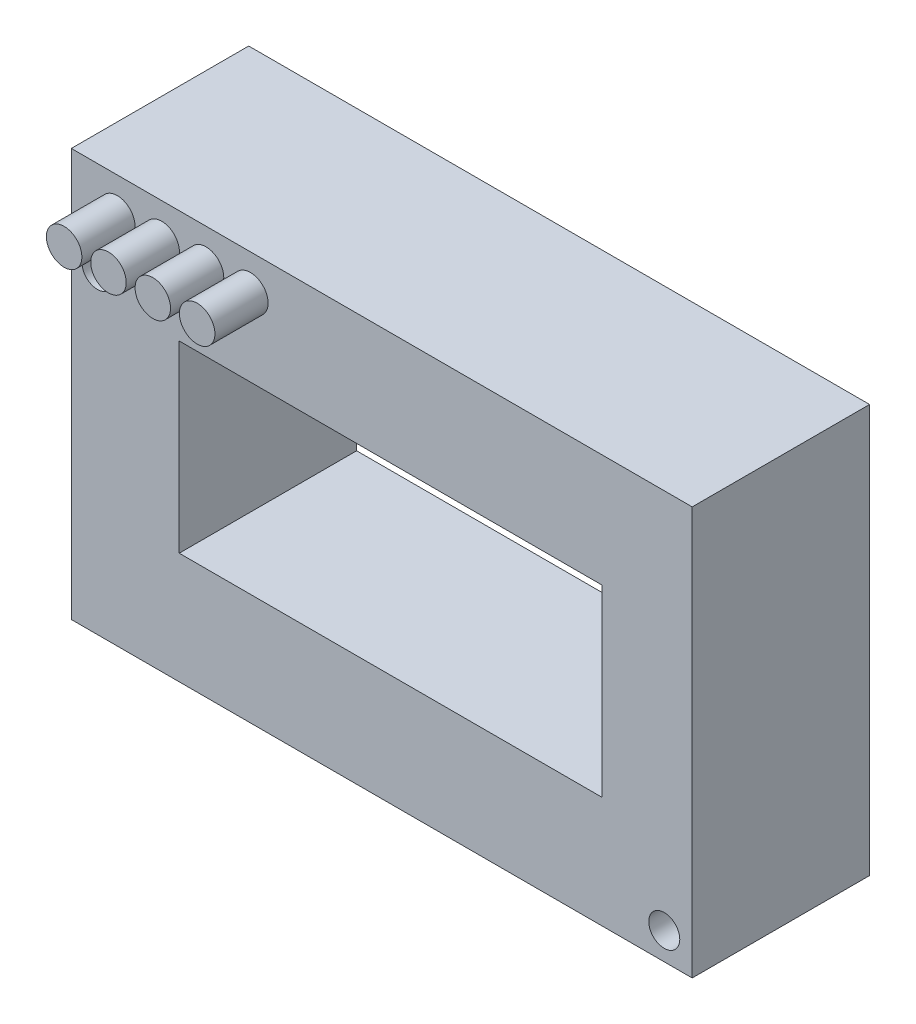
ISO-10303-21;
HEADER;
FILE_DESCRIPTION(('STEP AP214'),'2;1');
FILE_NAME('part.step','',(''),(''),'','','');
FILE_SCHEMA(('AUTOMOTIVE_DESIGN { 1 0 10303 214 1 1 1 1 }'));
ENDSEC;
DATA;
#1=APPLICATION_CONTEXT('core data for automotive mechanical design processes');
#2=APPLICATION_PROTOCOL_DEFINITION('international standard','automotive_design',2000,#1);
#3=PRODUCT_CONTEXT('',#1,'mechanical');
#4=PRODUCT('Part','Part','',(#3));
#5=PRODUCT_RELATED_PRODUCT_CATEGORY('part','',(#4));
#6=PRODUCT_DEFINITION_FORMATION('','',#4);
#7=PRODUCT_DEFINITION_CONTEXT('part definition',#1,'design');
#8=PRODUCT_DEFINITION('design','',#6,#7);
#9=PRODUCT_DEFINITION_SHAPE('','',#8);
#10=(LENGTH_UNIT() NAMED_UNIT(*) SI_UNIT(.MILLI.,.METRE.));
#11=(NAMED_UNIT(*) PLANE_ANGLE_UNIT() SI_UNIT($,.RADIAN.));
#12=(NAMED_UNIT(*) SI_UNIT($,.STERADIAN.) SOLID_ANGLE_UNIT());
#13=UNCERTAINTY_MEASURE_WITH_UNIT(LENGTH_MEASURE(1.E-05),#10,'distance_accuracy_value','');
#14=(GEOMETRIC_REPRESENTATION_CONTEXT(3) GLOBAL_UNCERTAINTY_ASSIGNED_CONTEXT((#13)) GLOBAL_UNIT_ASSIGNED_CONTEXT((#10,
#11,#12)) REPRESENTATION_CONTEXT('',''));
#15=CARTESIAN_POINT('',(0.,0.,0.));
#16=DIRECTION('',(0.,0.,1.));
#17=DIRECTION('',(1.,0.,0.));
#18=AXIS2_PLACEMENT_3D('',#15,#16,#17);
#19=CARTESIAN_POINT('',(-18.1409783445176,8.8263063063063,9.99999999999999));
#20=DIRECTION('',(1.,0.,0.));
#21=DIRECTION('',(0.,1.,0.));
#22=AXIS2_PLACEMENT_3D('',#19,#20,#21);
#23=PLANE('',#22);
#24=DIRECTION('',(0.,-1.,0.));
#25=VECTOR('',#24,1.);
#26=CARTESIAN_POINT('',(-18.1409783445176,8.8263063063063,0.));
#27=LINE('',#26,#25);
#28=CARTESIAN_POINT('',(-18.1409783445176,8.8263063063063,0.));
#29=VERTEX_POINT('',#28);
#30=CARTESIAN_POINT('',(-18.1409783445176,-14.1736936936937,0.));
#31=VERTEX_POINT('',#30);
#32=EDGE_CURVE('E135',#29,#31,#27,.T.);
#33=ORIENTED_EDGE('',*,*,#32,.T.);
#34=DIRECTION('',(0.,0.,-1.));
#35=VECTOR('',#34,1.);
#36=CARTESIAN_POINT('',(-18.1409783445176,-14.1736936936937,9.99999999999999));
#37=LINE('',#36,#35);
#38=CARTESIAN_POINT('',(-18.1409783445176,-14.1736936936937,9.99999999999999));
#39=VERTEX_POINT('',#38);
#40=EDGE_CURVE('E11',#39,#31,#37,.T.);
#41=ORIENTED_EDGE('',*,*,#40,.F.);
#42=DIRECTION('',(0.,-1.,0.));
#43=VECTOR('',#42,1.);
#44=CARTESIAN_POINT('',(-18.1409783445176,8.8263063063063,9.99999999999999));
#45=LINE('',#44,#43);
#46=CARTESIAN_POINT('',(-18.1409783445176,8.8263063063063,9.99999999999999));
#47=VERTEX_POINT('',#46);
#48=EDGE_CURVE('E139',#47,#39,#45,.T.);
#49=ORIENTED_EDGE('',*,*,#48,.F.);
#50=DIRECTION('',(0.,0.,-1.));
#51=VECTOR('',#50,1.);
#52=CARTESIAN_POINT('',(-18.1409783445176,8.8263063063063,9.99999999999999));
#53=LINE('',#52,#51);
#54=EDGE_CURVE('E149',#47,#29,#53,.T.);
#55=ORIENTED_EDGE('',*,*,#54,.T.);
#56=EDGE_LOOP('',(#33,#41,#49,#55));
#57=FACE_BOUND('',#56,.T.);
#58=ADVANCED_FACE('F34',(#57),#23,.F.);
#59=CARTESIAN_POINT('',(-18.1409783445176,-14.1736936936937,9.99999999999999));
#60=DIRECTION('',(0.,1.,0.));
#61=DIRECTION('',(0.,0.,1.));
#62=AXIS2_PLACEMENT_3D('',#59,#60,#61);
#63=PLANE('',#62);
#64=DIRECTION('',(1.,0.,0.));
#65=VECTOR('',#64,1.);
#66=CARTESIAN_POINT('',(-18.1409783445176,-14.1736936936937,0.));
#67=LINE('',#66,#65);
#68=CARTESIAN_POINT('',(16.8590216554824,-14.1736936936937,0.));
#69=VERTEX_POINT('',#68);
#70=EDGE_CURVE('E152',#31,#69,#67,.T.);
#71=ORIENTED_EDGE('',*,*,#70,.T.);
#72=DIRECTION('',(0.,0.,-1.));
#73=VECTOR('',#72,1.);
#74=CARTESIAN_POINT('',(16.8590216554824,-14.1736936936937,9.99999999999999));
#75=LINE('',#74,#73);
#76=CARTESIAN_POINT('',(16.8590216554824,-14.1736936936937,9.99999999999999));
#77=VERTEX_POINT('',#76);
#78=EDGE_CURVE('E41',#77,#69,#75,.T.);
#79=ORIENTED_EDGE('',*,*,#78,.F.);
#80=DIRECTION('',(1.,0.,0.));
#81=VECTOR('',#80,1.);
#82=CARTESIAN_POINT('',(-18.1409783445176,-14.1736936936937,9.99999999999999));
#83=LINE('',#82,#81);
#84=EDGE_CURVE('E142',#39,#77,#83,.T.);
#85=ORIENTED_EDGE('',*,*,#84,.F.);
#86=ORIENTED_EDGE('',*,*,#40,.T.);
#87=EDGE_LOOP('',(#71,#79,#85,#86));
#88=FACE_BOUND('',#87,.T.);
#89=ADVANCED_FACE('F180',(#88),#63,.F.);
#90=CARTESIAN_POINT('',(16.8590216554824,8.8263063063063,9.99999999999999));
#91=DIRECTION('',(-1.,0.,0.));
#92=DIRECTION('',(0.,0.,1.));
#93=AXIS2_PLACEMENT_3D('',#90,#91,#92);
#94=PLANE('',#93);
#95=DIRECTION('',(0.,1.,0.));
#96=VECTOR('',#95,1.);
#97=CARTESIAN_POINT('',(16.8590216554824,8.8263063063063,0.));
#98=LINE('',#97,#96);
#99=CARTESIAN_POINT('',(16.8590216554824,8.8263063063063,0.));
#100=VERTEX_POINT('',#99);
#101=EDGE_CURVE('E154',#69,#100,#98,.T.);
#102=ORIENTED_EDGE('',*,*,#101,.T.);
#103=DIRECTION('',(0.,0.,-1.));
#104=VECTOR('',#103,1.);
#105=CARTESIAN_POINT('',(16.8590216554824,8.8263063063063,9.99999999999999));
#106=LINE('',#105,#104);
#107=CARTESIAN_POINT('',(16.8590216554824,8.8263063063063,9.99999999999999));
#108=VERTEX_POINT('',#107);
#109=EDGE_CURVE('E159',#108,#100,#106,.T.);
#110=ORIENTED_EDGE('',*,*,#109,.F.);
#111=DIRECTION('',(0.,1.,0.));
#112=VECTOR('',#111,1.);
#113=CARTESIAN_POINT('',(16.8590216554824,8.8263063063063,9.99999999999999));
#114=LINE('',#113,#112);
#115=EDGE_CURVE('E145',#77,#108,#114,.T.);
#116=ORIENTED_EDGE('',*,*,#115,.F.);
#117=ORIENTED_EDGE('',*,*,#78,.T.);
#118=EDGE_LOOP('',(#102,#110,#116,#117));
#119=FACE_BOUND('',#118,.T.);
#120=ADVANCED_FACE('F166',(#119),#94,.F.);
#121=CARTESIAN_POINT('',(-18.1409783445176,8.8263063063063,9.99999999999999));
#122=DIRECTION('',(0.,-1.,0.));
#123=DIRECTION('',(0.,0.,-1.));
#124=AXIS2_PLACEMENT_3D('',#121,#122,#123);
#125=PLANE('',#124);
#126=DIRECTION('',(-1.,0.,0.));
#127=VECTOR('',#126,1.);
#128=CARTESIAN_POINT('',(-18.1409783445176,8.8263063063063,0.));
#129=LINE('',#128,#127);
#130=EDGE_CURVE('E143',#100,#29,#129,.T.);
#131=ORIENTED_EDGE('',*,*,#130,.T.);
#132=ORIENTED_EDGE('',*,*,#54,.F.);
#133=DIRECTION('',(-1.,0.,0.));
#134=VECTOR('',#133,1.);
#135=CARTESIAN_POINT('',(-18.1409783445176,8.8263063063063,9.99999999999999));
#136=LINE('',#135,#134);
#137=EDGE_CURVE('E147',#108,#47,#136,.T.);
#138=ORIENTED_EDGE('',*,*,#137,.F.);
#139=ORIENTED_EDGE('',*,*,#109,.T.);
#140=EDGE_LOOP('',(#131,#132,#138,#139));
#141=FACE_BOUND('',#140,.T.);
#142=ADVANCED_FACE('F173',(#141),#125,.F.);
#143=CARTESIAN_POINT('',(0.,0.,9.99999999999999));
#144=DIRECTION('',(0.,0.,1.));
#145=DIRECTION('',(1.,0.,0.));
#146=AXIS2_PLACEMENT_3D('',#143,#144,#145);
#147=PLANE('',#146);
#148=CARTESIAN_POINT('',(-8.04732334795002,6.81929444007118,9.99999999999999));
#149=DIRECTION('',(0.,0.,1.));
#150=DIRECTION('',(1.,0.,0.));
#151=AXIS2_PLACEMENT_3D('',#148,#149,#150);
#152=CIRCLE('',#151,1.);
#153=CARTESIAN_POINT('',(-7.04732334795002,6.81929444007118,9.99999999999999));
#154=VERTEX_POINT('',#153);
#155=EDGE_CURVE('E252',#154,#154,#152,.T.);
#156=ORIENTED_EDGE('',*,*,#155,.F.);
#157=EDGE_LOOP('',(#156));
#158=FACE_BOUND('',#157,.T.);
#159=CARTESIAN_POINT('',(-10.54732334795,6.81929444007118,9.99999999999999));
#160=DIRECTION('',(0.,0.,1.));
#161=DIRECTION('',(1.,0.,0.));
#162=AXIS2_PLACEMENT_3D('',#159,#160,#161);
#163=CIRCLE('',#162,1.);
#164=CARTESIAN_POINT('',(-9.54732334795002,6.81929444007118,9.99999999999999));
#165=VERTEX_POINT('',#164);
#166=EDGE_CURVE('E251',#165,#165,#163,.T.);
#167=ORIENTED_EDGE('',*,*,#166,.F.);
#168=EDGE_LOOP('',(#167));
#169=FACE_BOUND('',#168,.T.);
#170=CARTESIAN_POINT('',(-13.04732334795,6.81929444007118,9.99999999999999));
#171=DIRECTION('',(0.,0.,1.));
#172=DIRECTION('',(1.,0.,0.));
#173=AXIS2_PLACEMENT_3D('',#170,#171,#172);
#174=CIRCLE('',#173,1.);
#175=CARTESIAN_POINT('',(-12.04732334795,6.81929444007118,9.99999999999999));
#176=VERTEX_POINT('',#175);
#177=EDGE_CURVE('E261',#176,#176,#174,.T.);
#178=ORIENTED_EDGE('',*,*,#177,.F.);
#179=EDGE_LOOP('',(#178));
#180=FACE_BOUND('',#179,.T.);
#181=CARTESIAN_POINT('',(-15.54732334795,6.81929444007118,9.99999999999999));
#182=DIRECTION('',(0.,0.,1.));
#183=DIRECTION('',(1.,0.,0.));
#184=AXIS2_PLACEMENT_3D('',#181,#182,#183);
#185=CIRCLE('',#184,1.);
#186=CARTESIAN_POINT('',(-14.54732334795,6.81929444007118,9.99999999999999));
#187=VERTEX_POINT('',#186);
#188=EDGE_CURVE('E266',#187,#187,#185,.T.);
#189=ORIENTED_EDGE('',*,*,#188,.F.);
#190=EDGE_LOOP('',(#189));
#191=FACE_BOUND('',#190,.T.);
#192=CARTESIAN_POINT('',(-16.6659783445176,3.5513063063063,9.99999999999999));
#193=DIRECTION('',(0.,0.,1.));
#194=DIRECTION('',(1.,0.,0.));
#195=AXIS2_PLACEMENT_3D('',#192,#193,#194);
#196=CIRCLE('',#195,0.875000000000002);
#197=CARTESIAN_POINT('',(-15.7909783445176,3.5513063063063,9.99999999999999));
#198=VERTEX_POINT('',#197);
#199=EDGE_CURVE('E275',#198,#198,#196,.T.);
#200=ORIENTED_EDGE('',*,*,#199,.F.);
#201=EDGE_LOOP('',(#200));
#202=FACE_BOUND('',#201,.T.);
#203=CARTESIAN_POINT('',(15.2840216554824,-12.6386936936937,9.99999999999999));
#204=DIRECTION('',(0.,0.,1.));
#205=DIRECTION('',(1.,0.,0.));
#206=AXIS2_PLACEMENT_3D('',#203,#204,#205);
#207=CIRCLE('',#206,0.875000000000002);
#208=CARTESIAN_POINT('',(16.1590216554824,-12.6386936936937,9.99999999999999));
#209=VERTEX_POINT('',#208);
#210=EDGE_CURVE('E272',#209,#209,#207,.T.);
#211=ORIENTED_EDGE('',*,*,#210,.F.);
#212=EDGE_LOOP('',(#211));
#213=FACE_BOUND('',#212,.T.);
#214=DIRECTION('',(0.,-1.,0.));
#215=VECTOR('',#214,1.);
#216=CARTESIAN_POINT('',(-12.0581359113642,2.4670159960907,9.99999999999999));
#217=LINE('',#216,#215);
#218=CARTESIAN_POINT('',(-12.0581359113642,2.4670159960907,9.99999999999999));
#219=VERTEX_POINT('',#218);
#220=CARTESIAN_POINT('',(-12.0581359113642,-7.89410430890096,9.99999999999999));
#221=VERTEX_POINT('',#220);
#222=EDGE_CURVE('E48',#219,#221,#217,.T.);
#223=ORIENTED_EDGE('',*,*,#222,.F.);
#224=DIRECTION('',(-1.,0.,0.));
#225=VECTOR('',#224,1.);
#226=CARTESIAN_POINT('',(-12.0581359113642,2.4670159960907,9.99999999999999));
#227=LINE('',#226,#225);
#228=CARTESIAN_POINT('',(11.7724407901166,2.4670159960907,9.99999999999999));
#229=VERTEX_POINT('',#228);
#230=EDGE_CURVE('E116',#229,#219,#227,.T.);
#231=ORIENTED_EDGE('',*,*,#230,.F.);
#232=DIRECTION('',(0.,1.,0.));
#233=VECTOR('',#232,1.);
#234=CARTESIAN_POINT('',(11.7724407901166,2.4670159960907,9.99999999999999));
#235=LINE('',#234,#233);
#236=CARTESIAN_POINT('',(11.7724407901166,-7.89410430890096,9.99999999999999));
#237=VERTEX_POINT('',#236);
#238=EDGE_CURVE('E119',#237,#229,#235,.T.);
#239=ORIENTED_EDGE('',*,*,#238,.F.);
#240=DIRECTION('',(1.,0.,0.));
#241=VECTOR('',#240,1.);
#242=CARTESIAN_POINT('',(-12.0581359113642,-7.89410430890096,9.99999999999999));
#243=LINE('',#242,#241);
#244=EDGE_CURVE('E128',#221,#237,#243,.T.);
#245=ORIENTED_EDGE('',*,*,#244,.F.);
#246=EDGE_LOOP('',(#223,#231,#239,#245));
#247=FACE_BOUND('',#246,.T.);
#248=ORIENTED_EDGE('',*,*,#48,.T.);
#249=ORIENTED_EDGE('',*,*,#84,.T.);
#250=ORIENTED_EDGE('',*,*,#115,.T.);
#251=ORIENTED_EDGE('',*,*,#137,.T.);
#252=EDGE_LOOP('',(#248,#249,#250,#251));
#253=FACE_BOUND('',#252,.T.);
#254=ADVANCED_FACE('F179',(#158,#169,#180,#191,#202,#213,#247,#253),#147,.T.);
#255=CARTESIAN_POINT('',(0.,0.,0.));
#256=DIRECTION('',(0.,0.,1.));
#257=DIRECTION('',(1.,0.,0.));
#258=AXIS2_PLACEMENT_3D('',#255,#256,#257);
#259=PLANE('',#258);
#260=CARTESIAN_POINT('',(-16.6659783445176,3.5513063063063,0.));
#261=DIRECTION('',(0.,0.,1.));
#262=DIRECTION('',(1.,0.,0.));
#263=AXIS2_PLACEMENT_3D('',#260,#261,#262);
#264=CIRCLE('',#263,0.875000000000002);
#265=CARTESIAN_POINT('',(-15.7909783445176,3.5513063063063,0.));
#266=VERTEX_POINT('',#265);
#267=EDGE_CURVE('E129',#266,#266,#264,.F.);
#268=ORIENTED_EDGE('',*,*,#267,.F.);
#269=EDGE_LOOP('',(#268));
#270=FACE_BOUND('',#269,.T.);
#271=CARTESIAN_POINT('',(15.2840216554824,-12.6386936936937,0.));
#272=DIRECTION('',(0.,0.,1.));
#273=DIRECTION('',(1.,0.,0.));
#274=AXIS2_PLACEMENT_3D('',#271,#272,#273);
#275=CIRCLE('',#274,0.875000000000002);
#276=CARTESIAN_POINT('',(16.1590216554824,-12.6386936936937,0.));
#277=VERTEX_POINT('',#276);
#278=EDGE_CURVE('E122',#277,#277,#275,.F.);
#279=ORIENTED_EDGE('',*,*,#278,.F.);
#280=EDGE_LOOP('',(#279));
#281=FACE_BOUND('',#280,.T.);
#282=DIRECTION('',(-1.,0.,0.));
#283=VECTOR('',#282,1.);
#284=CARTESIAN_POINT('',(-12.0581359113642,2.4670159960907,0.));
#285=LINE('',#284,#283);
#286=CARTESIAN_POINT('',(11.7724407901166,2.4670159960907,0.));
#287=VERTEX_POINT('',#286);
#288=CARTESIAN_POINT('',(-12.0581359113642,2.4670159960907,0.));
#289=VERTEX_POINT('',#288);
#290=EDGE_CURVE('E106',#287,#289,#285,.T.);
#291=ORIENTED_EDGE('',*,*,#290,.T.);
#292=DIRECTION('',(0.,-1.,0.));
#293=VECTOR('',#292,1.);
#294=CARTESIAN_POINT('',(-12.0581359113642,2.4670159960907,0.));
#295=LINE('',#294,#293);
#296=CARTESIAN_POINT('',(-12.0581359113642,-7.89410430890096,0.));
#297=VERTEX_POINT('',#296);
#298=EDGE_CURVE('E100',#289,#297,#295,.T.);
#299=ORIENTED_EDGE('',*,*,#298,.T.);
#300=DIRECTION('',(1.,0.,0.));
#301=VECTOR('',#300,1.);
#302=CARTESIAN_POINT('',(-12.0581359113642,-7.89410430890096,0.));
#303=LINE('',#302,#301);
#304=CARTESIAN_POINT('',(11.7724407901166,-7.89410430890096,0.));
#305=VERTEX_POINT('',#304);
#306=EDGE_CURVE('E109',#297,#305,#303,.T.);
#307=ORIENTED_EDGE('',*,*,#306,.T.);
#308=DIRECTION('',(0.,1.,0.));
#309=VECTOR('',#308,1.);
#310=CARTESIAN_POINT('',(11.7724407901166,2.4670159960907,0.));
#311=LINE('',#310,#309);
#312=EDGE_CURVE('E56',#305,#287,#311,.T.);
#313=ORIENTED_EDGE('',*,*,#312,.T.);
#314=EDGE_LOOP('',(#291,#299,#307,#313));
#315=FACE_BOUND('',#314,.T.);
#316=ORIENTED_EDGE('',*,*,#32,.F.);
#317=ORIENTED_EDGE('',*,*,#130,.F.);
#318=ORIENTED_EDGE('',*,*,#101,.F.);
#319=ORIENTED_EDGE('',*,*,#70,.F.);
#320=EDGE_LOOP('',(#316,#317,#318,#319));
#321=FACE_BOUND('',#320,.T.);
#322=ADVANCED_FACE('F113',(#270,#281,#315,#321),#259,.F.);
#323=CARTESIAN_POINT('',(-12.0581359113642,2.4670159960907,0.));
#324=DIRECTION('',(-1.,0.,0.));
#325=DIRECTION('',(0.,0.,1.));
#326=AXIS2_PLACEMENT_3D('',#323,#324,#325);
#327=PLANE('',#326);
#328=ORIENTED_EDGE('',*,*,#222,.T.);
#329=DIRECTION('',(0.,0.,1.));
#330=VECTOR('',#329,1.);
#331=CARTESIAN_POINT('',(-12.0581359113642,-7.89410430890096,0.));
#332=LINE('',#331,#330);
#333=EDGE_CURVE('E96',#297,#221,#332,.T.);
#334=ORIENTED_EDGE('',*,*,#333,.F.);
#335=ORIENTED_EDGE('',*,*,#298,.F.);
#336=DIRECTION('',(0.,0.,1.));
#337=VECTOR('',#336,1.);
#338=CARTESIAN_POINT('',(-12.0581359113642,2.4670159960907,0.));
#339=LINE('',#338,#337);
#340=EDGE_CURVE('E133',#289,#219,#339,.T.);
#341=ORIENTED_EDGE('',*,*,#340,.T.);
#342=EDGE_LOOP('',(#328,#334,#335,#341));
#343=FACE_BOUND('',#342,.T.);
#344=ADVANCED_FACE('F98',(#343),#327,.F.);
#345=CARTESIAN_POINT('',(-12.0581359113642,2.4670159960907,0.));
#346=DIRECTION('',(0.,1.,0.));
#347=DIRECTION('',(0.,0.,1.));
#348=AXIS2_PLACEMENT_3D('',#345,#346,#347);
#349=PLANE('',#348);
#350=ORIENTED_EDGE('',*,*,#230,.T.);
#351=ORIENTED_EDGE('',*,*,#340,.F.);
#352=ORIENTED_EDGE('',*,*,#290,.F.);
#353=DIRECTION('',(0.,0.,1.));
#354=VECTOR('',#353,1.);
#355=CARTESIAN_POINT('',(11.7724407901166,2.4670159960907,0.));
#356=LINE('',#355,#354);
#357=EDGE_CURVE('E136',#287,#229,#356,.T.);
#358=ORIENTED_EDGE('',*,*,#357,.T.);
#359=EDGE_LOOP('',(#350,#351,#352,#358));
#360=FACE_BOUND('',#359,.T.);
#361=ADVANCED_FACE('F198',(#360),#349,.F.);
#362=CARTESIAN_POINT('',(11.7724407901166,2.4670159960907,0.));
#363=DIRECTION('',(1.,0.,0.));
#364=DIRECTION('',(0.,0.,-1.));
#365=AXIS2_PLACEMENT_3D('',#362,#363,#364);
#366=PLANE('',#365);
#367=ORIENTED_EDGE('',*,*,#238,.T.);
#368=ORIENTED_EDGE('',*,*,#357,.F.);
#369=ORIENTED_EDGE('',*,*,#312,.F.);
#370=DIRECTION('',(0.,0.,1.));
#371=VECTOR('',#370,1.);
#372=CARTESIAN_POINT('',(11.7724407901166,-7.89410430890096,0.));
#373=LINE('',#372,#371);
#374=EDGE_CURVE('E105',#305,#237,#373,.T.);
#375=ORIENTED_EDGE('',*,*,#374,.T.);
#376=EDGE_LOOP('',(#367,#368,#369,#375));
#377=FACE_BOUND('',#376,.T.);
#378=ADVANCED_FACE('F202',(#377),#366,.F.);
#379=CARTESIAN_POINT('',(-12.0581359113642,-7.89410430890096,0.));
#380=DIRECTION('',(0.,-1.,0.));
#381=DIRECTION('',(0.,0.,-1.));
#382=AXIS2_PLACEMENT_3D('',#379,#380,#381);
#383=PLANE('',#382);
#384=ORIENTED_EDGE('',*,*,#244,.T.);
#385=ORIENTED_EDGE('',*,*,#374,.F.);
#386=ORIENTED_EDGE('',*,*,#306,.F.);
#387=ORIENTED_EDGE('',*,*,#333,.T.);
#388=EDGE_LOOP('',(#384,#385,#386,#387));
#389=FACE_BOUND('',#388,.T.);
#390=ADVANCED_FACE('F110',(#389),#383,.F.);
#391=CARTESIAN_POINT('',(15.2840216554824,-12.6386936936937,-0.00100000000000447));
#392=DIRECTION('',(0.,0.,1.));
#393=DIRECTION('',(1.,0.,0.));
#394=AXIS2_PLACEMENT_3D('',#391,#392,#393);
#395=CYLINDRICAL_SURFACE('',#394,0.875000000000002);
#396=ORIENTED_EDGE('',*,*,#210,.T.);
#397=EDGE_LOOP('',(#396));
#398=FACE_BOUND('',#397,.T.);
#399=ORIENTED_EDGE('',*,*,#278,.T.);
#400=EDGE_LOOP('',(#399));
#401=FACE_BOUND('',#400,.T.);
#402=ADVANCED_FACE('F201',(#398,#401),#395,.F.);
#403=CARTESIAN_POINT('',(-16.6659783445176,3.5513063063063,-0.00100000000000447));
#404=DIRECTION('',(0.,0.,1.));
#405=DIRECTION('',(1.,0.,0.));
#406=AXIS2_PLACEMENT_3D('',#403,#404,#405);
#407=CYLINDRICAL_SURFACE('',#406,0.875000000000002);
#408=ORIENTED_EDGE('',*,*,#199,.T.);
#409=EDGE_LOOP('',(#408));
#410=FACE_BOUND('',#409,.T.);
#411=ORIENTED_EDGE('',*,*,#267,.T.);
#412=EDGE_LOOP('',(#411));
#413=FACE_BOUND('',#412,.T.);
#414=ADVANCED_FACE('F210',(#410,#413),#407,.F.);
#415=CARTESIAN_POINT('',(-15.54732334795,6.81929444007118,13.));
#416=DIRECTION('',(0.,0.,-1.));
#417=DIRECTION('',(-1.,0.,0.));
#418=AXIS2_PLACEMENT_3D('',#415,#416,#417);
#419=CYLINDRICAL_SURFACE('',#418,1.);
#420=CARTESIAN_POINT('',(-15.54732334795,6.81929444007118,13.));
#421=DIRECTION('',(0.,0.,1.));
#422=DIRECTION('',(1.,0.,0.));
#423=AXIS2_PLACEMENT_3D('',#420,#421,#422);
#424=CIRCLE('',#423,1.);
#425=CARTESIAN_POINT('',(-14.54732334795,6.81929444007118,13.));
#426=VERTEX_POINT('',#425);
#427=EDGE_CURVE('E269',#426,#426,#424,.T.);
#428=ORIENTED_EDGE('',*,*,#427,.F.);
#429=EDGE_LOOP('',(#428));
#430=FACE_BOUND('',#429,.T.);
#431=ORIENTED_EDGE('',*,*,#188,.T.);
#432=EDGE_LOOP('',(#431));
#433=FACE_BOUND('',#432,.T.);
#434=ADVANCED_FACE('F214',(#430,#433),#419,.T.);
#435=CARTESIAN_POINT('',(-15.54732334795,6.81929444007118,13.));
#436=DIRECTION('',(0.,0.,1.));
#437=DIRECTION('',(1.,0.,0.));
#438=AXIS2_PLACEMENT_3D('',#435,#436,#437);
#439=PLANE('',#438);
#440=ORIENTED_EDGE('',*,*,#427,.T.);
#441=EDGE_LOOP('',(#440));
#442=FACE_BOUND('',#441,.T.);
#443=ADVANCED_FACE('F218',(#442),#439,.T.);
#444=CARTESIAN_POINT('',(-13.04732334795,6.81929444007118,13.));
#445=DIRECTION('',(0.,0.,-1.));
#446=DIRECTION('',(-1.,0.,0.));
#447=AXIS2_PLACEMENT_3D('',#444,#445,#446);
#448=CYLINDRICAL_SURFACE('',#447,1.);
#449=CARTESIAN_POINT('',(-13.04732334795,6.81929444007118,13.));
#450=DIRECTION('',(0.,0.,1.));
#451=DIRECTION('',(1.,0.,0.));
#452=AXIS2_PLACEMENT_3D('',#449,#450,#451);
#453=CIRCLE('',#452,1.);
#454=CARTESIAN_POINT('',(-12.04732334795,6.81929444007118,13.));
#455=VERTEX_POINT('',#454);
#456=EDGE_CURVE('E263',#455,#455,#453,.T.);
#457=ORIENTED_EDGE('',*,*,#456,.F.);
#458=EDGE_LOOP('',(#457));
#459=FACE_BOUND('',#458,.T.);
#460=ORIENTED_EDGE('',*,*,#177,.T.);
#461=EDGE_LOOP('',(#460));
#462=FACE_BOUND('',#461,.T.);
#463=ADVANCED_FACE('F222',(#459,#462),#448,.T.);
#464=CARTESIAN_POINT('',(-13.04732334795,6.81929444007118,13.));
#465=DIRECTION('',(0.,0.,1.));
#466=DIRECTION('',(1.,0.,0.));
#467=AXIS2_PLACEMENT_3D('',#464,#465,#466);
#468=PLANE('',#467);
#469=ORIENTED_EDGE('',*,*,#456,.T.);
#470=EDGE_LOOP('',(#469));
#471=FACE_BOUND('',#470,.T.);
#472=ADVANCED_FACE('F226',(#471),#468,.T.);
#473=CARTESIAN_POINT('',(-10.54732334795,6.81929444007118,13.));
#474=DIRECTION('',(0.,0.,-1.));
#475=DIRECTION('',(-1.,0.,0.));
#476=AXIS2_PLACEMENT_3D('',#473,#474,#475);
#477=CYLINDRICAL_SURFACE('',#476,1.);
#478=CARTESIAN_POINT('',(-10.54732334795,6.81929444007118,13.));
#479=DIRECTION('',(0.,0.,1.));
#480=DIRECTION('',(1.,0.,0.));
#481=AXIS2_PLACEMENT_3D('',#478,#479,#480);
#482=CIRCLE('',#481,1.);
#483=CARTESIAN_POINT('',(-9.54732334795002,6.81929444007118,13.));
#484=VERTEX_POINT('',#483);
#485=EDGE_CURVE('E255',#484,#484,#482,.T.);
#486=ORIENTED_EDGE('',*,*,#485,.F.);
#487=EDGE_LOOP('',(#486));
#488=FACE_BOUND('',#487,.T.);
#489=ORIENTED_EDGE('',*,*,#166,.T.);
#490=EDGE_LOOP('',(#489));
#491=FACE_BOUND('',#490,.T.);
#492=ADVANCED_FACE('F230',(#488,#491),#477,.T.);
#493=CARTESIAN_POINT('',(-10.54732334795,6.81929444007118,13.));
#494=DIRECTION('',(0.,0.,1.));
#495=DIRECTION('',(1.,0.,0.));
#496=AXIS2_PLACEMENT_3D('',#493,#494,#495);
#497=PLANE('',#496);
#498=ORIENTED_EDGE('',*,*,#485,.T.);
#499=EDGE_LOOP('',(#498));
#500=FACE_BOUND('',#499,.T.);
#501=ADVANCED_FACE('F234',(#500),#497,.T.);
#502=CARTESIAN_POINT('',(-8.04732334795002,6.81929444007118,13.));
#503=DIRECTION('',(0.,0.,-1.));
#504=DIRECTION('',(-1.,0.,0.));
#505=AXIS2_PLACEMENT_3D('',#502,#503,#504);
#506=CYLINDRICAL_SURFACE('',#505,1.);
#507=CARTESIAN_POINT('',(-8.04732334795002,6.81929444007118,13.));
#508=DIRECTION('',(0.,0.,1.));
#509=DIRECTION('',(1.,0.,0.));
#510=AXIS2_PLACEMENT_3D('',#507,#508,#509);
#511=CIRCLE('',#510,1.);
#512=CARTESIAN_POINT('',(-7.04732334795002,6.81929444007118,13.));
#513=VERTEX_POINT('',#512);
#514=EDGE_CURVE('E250',#513,#513,#511,.T.);
#515=ORIENTED_EDGE('',*,*,#514,.F.);
#516=EDGE_LOOP('',(#515));
#517=FACE_BOUND('',#516,.T.);
#518=ORIENTED_EDGE('',*,*,#155,.T.);
#519=EDGE_LOOP('',(#518));
#520=FACE_BOUND('',#519,.T.);
#521=ADVANCED_FACE('F238',(#517,#520),#506,.T.);
#522=CARTESIAN_POINT('',(-8.04732334795002,6.81929444007118,13.));
#523=DIRECTION('',(0.,0.,1.));
#524=DIRECTION('',(1.,0.,0.));
#525=AXIS2_PLACEMENT_3D('',#522,#523,#524);
#526=PLANE('',#525);
#527=ORIENTED_EDGE('',*,*,#514,.T.);
#528=EDGE_LOOP('',(#527));
#529=FACE_BOUND('',#528,.T.);
#530=ADVANCED_FACE('F242',(#529),#526,.T.);
#531=CLOSED_SHELL('',(#58,#89,#120,#142,#254,#322,#344,#361,#378,#390,#402,#414,#434,#443,#463,
#472,#492,#501,#521,#530));
#532=MANIFOLD_SOLID_BREP('B2',#531);
#533=ADVANCED_BREP_SHAPE_REPRESENTATION('',(#18,#532),#14);
#534=SHAPE_DEFINITION_REPRESENTATION(#9,#533);
ENDSEC;
END-ISO-10303-21;
